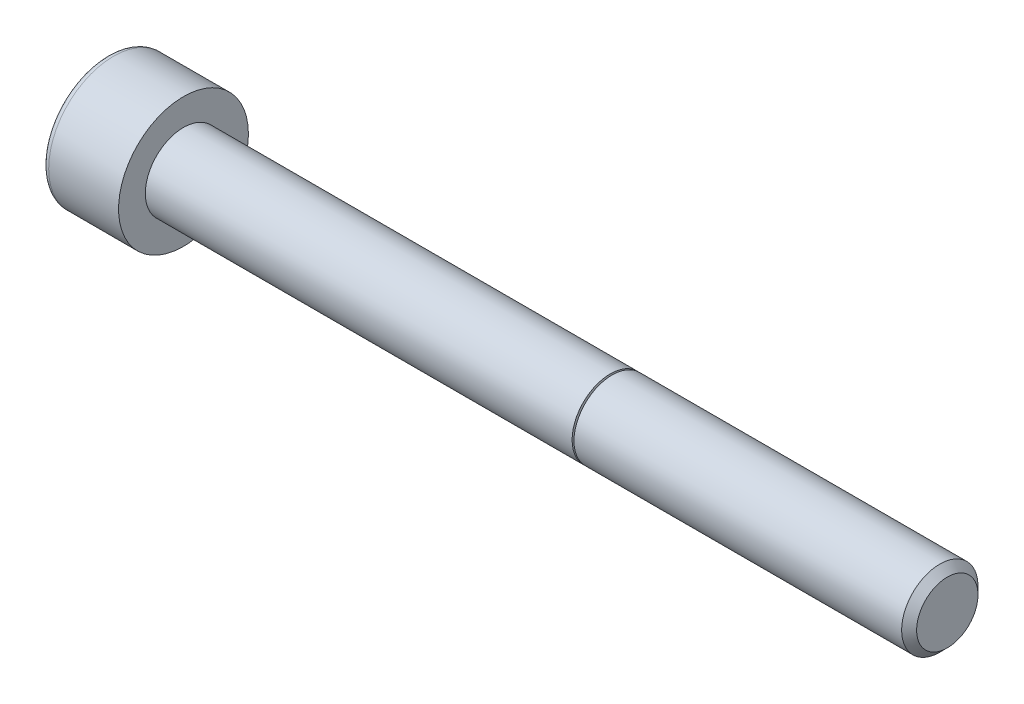
ISO-10303-21;
HEADER;
FILE_DESCRIPTION(('STEP AP214'),'2;1');
FILE_NAME('part.step','',(''),(''),'','','');
FILE_SCHEMA(('AUTOMOTIVE_DESIGN { 1 0 10303 214 1 1 1 1 }'));
ENDSEC;
DATA;
#1=APPLICATION_CONTEXT('core data for automotive mechanical design processes');
#2=APPLICATION_PROTOCOL_DEFINITION('international standard','automotive_design',2000,#1);
#3=PRODUCT_CONTEXT('',#1,'mechanical');
#4=PRODUCT('Part','Part','',(#3));
#5=PRODUCT_RELATED_PRODUCT_CATEGORY('part','',(#4));
#6=PRODUCT_DEFINITION_FORMATION('','',#4);
#7=PRODUCT_DEFINITION_CONTEXT('part definition',#1,'design');
#8=PRODUCT_DEFINITION('design','',#6,#7);
#9=PRODUCT_DEFINITION_SHAPE('','',#8);
#10=(LENGTH_UNIT() NAMED_UNIT(*) SI_UNIT(.MILLI.,.METRE.));
#11=(NAMED_UNIT(*) PLANE_ANGLE_UNIT() SI_UNIT($,.RADIAN.));
#12=(NAMED_UNIT(*) SI_UNIT($,.STERADIAN.) SOLID_ANGLE_UNIT());
#13=UNCERTAINTY_MEASURE_WITH_UNIT(LENGTH_MEASURE(1.E-05),#10,'distance_accuracy_value','');
#14=(GEOMETRIC_REPRESENTATION_CONTEXT(3) GLOBAL_UNCERTAINTY_ASSIGNED_CONTEXT((#13)) GLOBAL_UNIT_ASSIGNED_CONTEXT((#10,
#11,#12)) REPRESENTATION_CONTEXT('',''));
#15=CARTESIAN_POINT('',(0.,0.,0.));
#16=DIRECTION('',(0.,0.,1.));
#17=DIRECTION('',(1.,0.,0.));
#18=AXIS2_PLACEMENT_3D('',#15,#16,#17);
#19=CARTESIAN_POINT('',(50.,-2.04969,2.0095));
#20=DIRECTION('',(1.,0.,0.));
#21=DIRECTION('',(0.,0.,-1.));
#22=AXIS2_PLACEMENT_3D('',#19,#20,#21);
#23=PLANE('',#22);
#24=CARTESIAN_POINT('',(50.,0.,0.));
#25=DIRECTION('',(-1.,0.,0.));
#26=DIRECTION('',(0.,0.,1.));
#27=AXIS2_PLACEMENT_3D('',#24,#25,#26);
#28=CIRCLE('',#27,2.00950000000001);
#29=CARTESIAN_POINT('',(50.,0.,2.00950000000001));
#30=VERTEX_POINT('',#29);
#31=EDGE_CURVE('E20',#30,#30,#28,.T.);
#32=ORIENTED_EDGE('',*,*,#31,.F.);
#33=EDGE_LOOP('',(#32));
#34=FACE_BOUND('',#33,.T.);
#35=ADVANCED_FACE('F16',(#34),#23,.T.);
#36=CARTESIAN_POINT('',(50.,0.,0.));
#37=DIRECTION('',(-1.,0.,0.));
#38=DIRECTION('',(0.,0.,1.));
#39=AXIS2_PLACEMENT_3D('',#36,#37,#38);
#40=CONICAL_SURFACE('',#39,2.0095,0.785398163397452);
#41=ORIENTED_EDGE('',*,*,#31,.T.);
#42=EDGE_LOOP('',(#41));
#43=FACE_BOUND('',#42,.T.);
#44=CARTESIAN_POINT('',(49.5095,0.,0.));
#45=DIRECTION('',(-1.,0.,0.));
#46=DIRECTION('',(0.,-1.,0.));
#47=AXIS2_PLACEMENT_3D('',#44,#45,#46);
#48=CIRCLE('',#47,2.5);
#49=CARTESIAN_POINT('',(49.5095,-2.49999999999999,0.));
#50=VERTEX_POINT('',#49);
#51=EDGE_CURVE('E122',#50,#50,#48,.T.);
#52=ORIENTED_EDGE('',*,*,#51,.F.);
#53=EDGE_LOOP('',(#52));
#54=FACE_BOUND('',#53,.T.);
#55=ADVANCED_FACE('F235',(#43,#54),#40,.T.);
#56=CARTESIAN_POINT('',(49.5095,0.,0.));
#57=DIRECTION('',(-1.,0.,0.));
#58=DIRECTION('',(0.,-1.,0.));
#59=AXIS2_PLACEMENT_3D('',#56,#57,#58);
#60=CYLINDRICAL_SURFACE('',#59,2.5);
#61=CARTESIAN_POINT('',(28.0613125,0.,0.));
#62=DIRECTION('',(-1.,0.,0.));
#63=DIRECTION('',(0.,0.,1.));
#64=AXIS2_PLACEMENT_3D('',#61,#62,#63);
#65=CIRCLE('',#64,2.5000000000001);
#66=CARTESIAN_POINT('',(28.0613125,0.,2.5000000000001));
#67=VERTEX_POINT('',#66);
#68=EDGE_CURVE('E119',#67,#67,#65,.T.);
#69=ORIENTED_EDGE('',*,*,#68,.F.);
#70=EDGE_LOOP('',(#69));
#71=FACE_BOUND('',#70,.T.);
#72=ORIENTED_EDGE('',*,*,#51,.T.);
#73=EDGE_LOOP('',(#72));
#74=FACE_BOUND('',#73,.T.);
#75=ADVANCED_FACE('F229',(#71,#74),#60,.T.);
#76=CARTESIAN_POINT('',(28.,0.,0.));
#77=DIRECTION('',(1.,0.,0.));
#78=DIRECTION('',(0.,0.,-1.));
#79=AXIS2_PLACEMENT_3D('',#76,#77,#78);
#80=CONICAL_SURFACE('',#79,2.0095,1.44644133224817);
#81=CARTESIAN_POINT('',(28.,0.,0.));
#82=DIRECTION('',(-1.,0.,0.));
#83=DIRECTION('',(0.,0.,1.));
#84=AXIS2_PLACEMENT_3D('',#81,#82,#83);
#85=CIRCLE('',#84,2.0095);
#86=CARTESIAN_POINT('',(28.,0.,2.0095));
#87=VERTEX_POINT('',#86);
#88=EDGE_CURVE('E116',#87,#87,#85,.T.);
#89=ORIENTED_EDGE('',*,*,#88,.F.);
#90=EDGE_LOOP('',(#89));
#91=FACE_BOUND('',#90,.T.);
#92=ORIENTED_EDGE('',*,*,#68,.T.);
#93=EDGE_LOOP('',(#92));
#94=FACE_BOUND('',#93,.T.);
#95=ADVANCED_FACE('F223',(#91,#94),#80,.T.);
#96=CARTESIAN_POINT('',(27.9386875,0.,0.));
#97=DIRECTION('',(-1.,0.,0.));
#98=DIRECTION('',(0.,0.,1.));
#99=AXIS2_PLACEMENT_3D('',#96,#97,#98);
#100=CONICAL_SURFACE('',#99,2.5,1.44644133224813);
#101=CARTESIAN_POINT('',(27.9386875,0.,0.));
#102=DIRECTION('',(-1.,0.,0.));
#103=DIRECTION('',(0.,0.,1.));
#104=AXIS2_PLACEMENT_3D('',#101,#102,#103);
#105=CIRCLE('',#104,2.5);
#106=CARTESIAN_POINT('',(27.9386875,0.,2.50000000000001));
#107=VERTEX_POINT('',#106);
#108=EDGE_CURVE('E113',#107,#107,#105,.T.);
#109=ORIENTED_EDGE('',*,*,#108,.F.);
#110=EDGE_LOOP('',(#109));
#111=FACE_BOUND('',#110,.T.);
#112=ORIENTED_EDGE('',*,*,#88,.T.);
#113=EDGE_LOOP('',(#112));
#114=FACE_BOUND('',#113,.T.);
#115=ADVANCED_FACE('F218',(#111,#114),#100,.T.);
#116=CARTESIAN_POINT('',(27.9386875,0.,0.));
#117=DIRECTION('',(-1.,0.,0.));
#118=DIRECTION('',(0.,0.,1.));
#119=AXIS2_PLACEMENT_3D('',#116,#117,#118);
#120=CYLINDRICAL_SURFACE('',#119,2.5);
#121=CARTESIAN_POINT('',(0.,0.,0.));
#122=DIRECTION('',(-1.,0.,0.));
#123=DIRECTION('',(0.,0.,1.));
#124=AXIS2_PLACEMENT_3D('',#121,#122,#123);
#125=CIRCLE('',#124,2.5);
#126=CARTESIAN_POINT('',(0.,0.,2.50000000000001));
#127=VERTEX_POINT('',#126);
#128=EDGE_CURVE('E92',#127,#127,#125,.T.);
#129=ORIENTED_EDGE('',*,*,#128,.F.);
#130=EDGE_LOOP('',(#129));
#131=FACE_BOUND('',#130,.T.);
#132=ORIENTED_EDGE('',*,*,#108,.T.);
#133=EDGE_LOOP('',(#132));
#134=FACE_BOUND('',#133,.T.);
#135=ADVANCED_FACE('F215',(#131,#134),#120,.T.);
#136=CARTESIAN_POINT('',(-1.9,0.,0.));
#137=DIRECTION('',(-1.,0.,0.));
#138=DIRECTION('',(0.,0.,1.));
#139=AXIS2_PLACEMENT_3D('',#136,#137,#138);
#140=CONICAL_SURFACE('',#139,2.3094010767585,1.0471975511966);
#141=CARTESIAN_POINT('',(-1.9,0.,2.3094010767585));
#142=CARTESIAN_POINT('',(-1.87069554512665,-0.0878878875630438,2.25865898121547));
#143=CARTESIAN_POINT('',(-1.84404467710022,-0.176534422121215,2.20747888062559));
#144=CARTESIAN_POINT('',(-1.79752638740027,-0.355362346686105,2.10423253023943));
#145=CARTESIAN_POINT('',(-1.77767542033809,-0.44554691308464,2.05216444655249));
#146=CARTESIAN_POINT('',(-1.74677595894609,-0.624798433758891,1.94867353283856));
#147=CARTESIAN_POINT('',(-1.73552178759691,-0.713837815616439,1.89726662175463));
#148=CARTESIAN_POINT('',(-1.72208916813045,-0.892335320462004,1.79421103928237));
#149=CARTESIAN_POINT('',(-1.7198995939742,-0.981792795105295,1.74256274221605));
#150=CARTESIAN_POINT('',(-1.72446629015479,-1.14893448970974,1.64606343984337));
#151=CARTESIAN_POINT('',(-1.73010128521626,-1.22664379064383,1.60119795403054));
#152=CARTESIAN_POINT('',(-1.74795730071816,-1.38155614176471,1.5117592664101));
#153=CARTESIAN_POINT('',(-1.76018441476867,-1.45875865655097,1.46718637371614));
#154=CARTESIAN_POINT('',(-1.79074983333835,-1.61399014172453,1.37756343396448));
#155=CARTESIAN_POINT('',(-1.80921764221832,-1.69199947538354,1.33252472417715));
#156=CARTESIAN_POINT('',(-1.85113176083937,-1.84685497000488,1.24311886267203));
#157=CARTESIAN_POINT('',(-1.87456822875222,-1.92370311331472,1.19875056644538));
#158=CARTESIAN_POINT('',(-1.90000000000001,-1.99999999999999,1.15470053837931));
#159=B_SPLINE_CURVE_WITH_KNOTS('',3,(#141,#142,#143,#144,#145,#146,#147,#148,#149,#150,#151,
#152,#153,#154,#155,#156,#157,#158),.UNSPECIFIED.,.F.,.F.,(4,2,2,2,2,2,2,2,4),(0.,
0.317016011556855,0.634793817027109,0.944707606152922,1.25424088889782,1.52370778263188,
1.79342419379439,2.06912162248864,2.34427797351492),.UNSPECIFIED.);
#160=CARTESIAN_POINT('',(-1.9,0.,2.3094010767585));
#161=VERTEX_POINT('',#160);
#162=CARTESIAN_POINT('',(-1.90000000000001,-2.,1.1547005383793));
#163=VERTEX_POINT('',#162);
#164=EDGE_CURVE('E82',#161,#163,#159,.T.);
#165=ORIENTED_EDGE('',*,*,#164,.F.);
#166=CARTESIAN_POINT('',(-1.90000000000002,2.,1.1547005383793));
#167=CARTESIAN_POINT('',(-1.87069554512667,1.91211211243696,1.20544263392233));
#168=CARTESIAN_POINT('',(-1.84404467710023,1.82346557787879,1.25662273451221));
#169=CARTESIAN_POINT('',(-1.79752638740028,1.6446376533139,1.35986908489837));
#170=CARTESIAN_POINT('',(-1.7776754203381,1.55445308691536,1.41193716858531));
#171=CARTESIAN_POINT('',(-1.74677595894609,1.37520156624111,1.51542808229924));
#172=CARTESIAN_POINT('',(-1.73552178759691,1.28616218438356,1.56683499338317));
#173=CARTESIAN_POINT('',(-1.72208916813045,1.10766467953799,1.66989057585543));
#174=CARTESIAN_POINT('',(-1.7198995939742,1.0182072048947,1.72153887292176));
#175=CARTESIAN_POINT('',(-1.72446629015479,0.851065510290257,1.81803817529444));
#176=CARTESIAN_POINT('',(-1.73010128521625,0.773356209356166,1.86290366110727));
#177=CARTESIAN_POINT('',(-1.74795730071815,0.618443858235278,1.95234234872771));
#178=CARTESIAN_POINT('',(-1.76018441476867,0.541241343449025,1.99691524142166));
#179=CARTESIAN_POINT('',(-1.79074983333834,0.386009858275461,2.08653818117332));
#180=CARTESIAN_POINT('',(-1.80921764221831,0.308000524616451,2.13157689096065));
#181=CARTESIAN_POINT('',(-1.85113176083936,0.153145029995107,2.22098275246578));
#182=CARTESIAN_POINT('',(-1.87456822875221,0.0762968866852722,2.26535104869243));
#183=CARTESIAN_POINT('',(-1.9,0.,2.3094010767585));
#184=B_SPLINE_CURVE_WITH_KNOTS('',3,(#166,#167,#168,#169,#170,#171,#172,#173,#174,#175,#176,
#177,#178,#179,#180,#181,#182,#183),.UNSPECIFIED.,.F.,.F.,(4,2,2,2,2,2,2,2,4),(0.,
0.317016011556859,0.634793817027117,0.944707606152934,1.25424088889784,1.5237077826319,
1.7934241937944,2.06912162248865,2.34427797351493),.UNSPECIFIED.);
#185=CARTESIAN_POINT('',(-1.90000000000001,2.,1.15470053837929));
#186=VERTEX_POINT('',#185);
#187=EDGE_CURVE('E79',#186,#161,#184,.T.);
#188=ORIENTED_EDGE('',*,*,#187,.F.);
#189=CARTESIAN_POINT('',(-1.9,2.,-1.15470053837923));
#190=CARTESIAN_POINT('',(-1.87069554512665,2.,-1.05321634729317));
#191=CARTESIAN_POINT('',(-1.84404467710021,2.,-0.950856146113392));
#192=CARTESIAN_POINT('',(-1.79752638740026,2.,-0.744363445341073));
#193=CARTESIAN_POINT('',(-1.77767542033809,2.,-0.640227277967187));
#194=CARTESIAN_POINT('',(-1.74677595894608,2.,-0.433245450539333));
#195=CARTESIAN_POINT('',(-1.7355217875969,2.,-0.330431628371469));
#196=CARTESIAN_POINT('',(-1.72208916813044,2.,-0.124320463426946));
#197=CARTESIAN_POINT('',(-1.71989959397419,2.,-0.0210238692942912));
#198=CARTESIAN_POINT('',(-1.72446629015478,2.,0.171974735451078));
#199=CARTESIAN_POINT('',(-1.73010128521625,2.,0.261705707076751));
#200=CARTESIAN_POINT('',(-1.74795730071815,2.,0.44058308231764));
#201=CARTESIAN_POINT('',(-1.76018441476866,2.,0.529728867705562));
#202=CARTESIAN_POINT('',(-1.79074983333834,2.,0.708974747208891));
#203=CARTESIAN_POINT('',(-1.80921764221831,2.,0.799052166783559));
#204=CARTESIAN_POINT('',(-1.85113176083936,2.,0.977863889793815));
#205=CARTESIAN_POINT('',(-1.87456822875222,2.,1.06660048224713));
#206=CARTESIAN_POINT('',(-1.90000000000001,2.,1.15470053837928));
#207=B_SPLINE_CURVE_WITH_KNOTS('',3,(#189,#190,#191,#192,#193,#194,#195,#196,#197,#198,#199,
#200,#201,#202,#203,#204,#205,#206),.UNSPECIFIED.,.F.,.F.,(4,2,2,2,2,2,2,2,4),(0.,
0.317016011556853,0.634793817027106,0.944707606152917,1.25424088889781,1.52370778263189,
1.7934241937944,2.06912162248866,2.34427797351496),.UNSPECIFIED.);
#208=CARTESIAN_POINT('',(-1.89999999999999,2.,-1.15470053837921));
#209=VERTEX_POINT('',#208);
#210=EDGE_CURVE('E67',#209,#186,#207,.T.);
#211=ORIENTED_EDGE('',*,*,#210,.F.);
#212=CARTESIAN_POINT('',(-1.9,0.,-2.3094010767585));
#213=CARTESIAN_POINT('',(-1.87069554512665,0.0878878875630413,-2.25865898121547));
#214=CARTESIAN_POINT('',(-1.84404467710021,0.17653442212121,-2.20747888062558));
#215=CARTESIAN_POINT('',(-1.79752638740026,0.355362346686095,-2.10423253023942));
#216=CARTESIAN_POINT('',(-1.77767542033808,0.445546913084628,-2.05216444655247));
#217=CARTESIAN_POINT('',(-1.74677595894607,0.624798433758874,-1.94867353283854));
#218=CARTESIAN_POINT('',(-1.73552178759689,0.71383781561642,-1.89726662175461));
#219=CARTESIAN_POINT('',(-1.72208916813043,0.89233532046198,-1.79421103928234));
#220=CARTESIAN_POINT('',(-1.71989959397418,0.981792795105269,-1.74256274221601));
#221=CARTESIAN_POINT('',(-1.72446629015476,1.14893448970971,-1.64606343984333));
#222=CARTESIAN_POINT('',(-1.73010128521623,1.2266437906438,-1.60119795403049));
#223=CARTESIAN_POINT('',(-1.74795730071813,1.3815561417647,-1.51175926641004));
#224=CARTESIAN_POINT('',(-1.76018441476864,1.45875865655095,-1.46718637371607));
#225=CARTESIAN_POINT('',(-1.79074983333831,1.61399014172452,-1.37756343396441));
#226=CARTESIAN_POINT('',(-1.80921764221829,1.69199947538354,-1.33252472417707));
#227=CARTESIAN_POINT('',(-1.85113176083934,1.84685497000489,-1.24311886267194));
#228=CARTESIAN_POINT('',(-1.87456822875219,1.92370311331472,-1.19875056644528));
#229=CARTESIAN_POINT('',(-1.89999999999999,2.,-1.1547005383792));
#230=B_SPLINE_CURVE_WITH_KNOTS('',3,(#212,#213,#214,#215,#216,#217,#218,#219,#220,#221,#222,
#223,#224,#225,#226,#227,#228,#229),.UNSPECIFIED.,.F.,.F.,(4,2,2,2,2,2,2,2,4),(0.,
0.317016011556855,0.634793817027109,0.944707606152921,1.25424088889782,1.5237077826319,
1.79342419379442,2.06912162248868,2.34427797351498),.UNSPECIFIED.);
#231=CARTESIAN_POINT('',(-1.9,0.,-2.3094010767585));
#232=VERTEX_POINT('',#231);
#233=EDGE_CURVE('E134',#232,#209,#230,.T.);
#234=ORIENTED_EDGE('',*,*,#233,.F.);
#235=CARTESIAN_POINT('',(-1.90000000000001,-1.99999999999999,-1.1547005383793));
#236=CARTESIAN_POINT('',(-1.87069554512666,-1.91211211243695,-1.20544263392233));
#237=CARTESIAN_POINT('',(-1.84404467710023,-1.82346557787878,-1.25662273451222));
#238=CARTESIAN_POINT('',(-1.79752638740027,-1.64463765331388,-1.35986908489838));
#239=CARTESIAN_POINT('',(-1.7776754203381,-1.55445308691535,-1.41193716858532));
#240=CARTESIAN_POINT('',(-1.74677595894609,-1.3752015662411,-1.51542808229924));
#241=CARTESIAN_POINT('',(-1.73552178759691,-1.28616218438355,-1.56683499338317));
#242=CARTESIAN_POINT('',(-1.72208916813045,-1.10766467953798,-1.66989057585543));
#243=CARTESIAN_POINT('',(-1.7198995939742,-1.01820720489469,-1.72153887292176));
#244=CARTESIAN_POINT('',(-1.72446629015479,-0.851065510290249,-1.81803817529444));
#245=CARTESIAN_POINT('',(-1.73010128521626,-0.773356209356158,-1.86290366110727));
#246=CARTESIAN_POINT('',(-1.74795730071816,-0.618443858235273,-1.95234234872771));
#247=CARTESIAN_POINT('',(-1.76018441476867,-0.541241343449019,-1.99691524142167));
#248=CARTESIAN_POINT('',(-1.79074983333834,-0.386009858275457,-2.08653818117332));
#249=CARTESIAN_POINT('',(-1.80921764221831,-0.308000524616448,-2.13157689096065));
#250=CARTESIAN_POINT('',(-1.85113176083936,-0.153145029995106,-2.22098275246578));
#251=CARTESIAN_POINT('',(-1.87456822875221,-0.0762968866852709,-2.26535104869243));
#252=CARTESIAN_POINT('',(-1.9,0.,-2.3094010767585));
#253=B_SPLINE_CURVE_WITH_KNOTS('',3,(#235,#236,#237,#238,#239,#240,#241,#242,#243,#244,#245,
#246,#247,#248,#249,#250,#251,#252),.UNSPECIFIED.,.F.,.F.,(4,2,2,2,2,2,2,2,4),(0.,
0.317016011556858,0.634793817027115,0.944707606152931,1.25424088889783,1.52370778263189,
1.79342419379439,2.06912162248864,2.34427797351492),.UNSPECIFIED.);
#254=CARTESIAN_POINT('',(-1.90000000000001,-2.,-1.1547005383793));
#255=VERTEX_POINT('',#254);
#256=EDGE_CURVE('E142',#255,#232,#253,.T.);
#257=ORIENTED_EDGE('',*,*,#256,.F.);
#258=CARTESIAN_POINT('',(-1.90000000000001,-2.,1.15470053837929));
#259=CARTESIAN_POINT('',(-1.87069554512666,-2.,1.05321634729323));
#260=CARTESIAN_POINT('',(-1.84404467710023,-2.,0.950856146113455));
#261=CARTESIAN_POINT('',(-1.79752638740027,-2.,0.744363445341134));
#262=CARTESIAN_POINT('',(-1.7776754203381,-2.,0.640227277967246));
#263=CARTESIAN_POINT('',(-1.74677595894609,-2.,0.43324545053939));
#264=CARTESIAN_POINT('',(-1.73552178759691,-2.,0.330431628371524));
#265=CARTESIAN_POINT('',(-1.72208916813044,-2.,0.124320463426999));
#266=CARTESIAN_POINT('',(-1.71989959397419,-2.,0.0210238692943427));
#267=CARTESIAN_POINT('',(-1.72446629015478,-2.,-0.171974735451032));
#268=CARTESIAN_POINT('',(-1.73010128521624,-2.,-0.261705707076711));
#269=CARTESIAN_POINT('',(-1.74795730071814,-2.,-0.440583082317611));
#270=CARTESIAN_POINT('',(-1.76018441476866,-2.,-0.529728867705538));
#271=CARTESIAN_POINT('',(-1.79074983333833,-2.,-0.708974747208878));
#272=CARTESIAN_POINT('',(-1.80921764221831,-2.,-0.799052166783552));
#273=CARTESIAN_POINT('',(-1.85113176083936,-2.,-0.977863889793819));
#274=CARTESIAN_POINT('',(-1.87456822875222,-2.,-1.06660048224714));
#275=CARTESIAN_POINT('',(-1.90000000000001,-2.,-1.15470053837929));
#276=B_SPLINE_CURVE_WITH_KNOTS('',3,(#258,#259,#260,#261,#262,#263,#264,#265,#266,#267,#268,
#269,#270,#271,#272,#273,#274,#275),.UNSPECIFIED.,.F.,.F.,(4,2,2,2,2,2,2,2,4),(0.,
0.317016011556858,0.634793817027115,0.944707606152931,1.25424088889783,1.52370778263192,
1.79342419379445,2.06912162248873,2.34427797351504),.UNSPECIFIED.);
#277=EDGE_CURVE('E184',#163,#255,#276,.T.);
#278=ORIENTED_EDGE('',*,*,#277,.F.);
#279=EDGE_LOOP('',(#165,#188,#211,#234,#257,#278));
#280=FACE_BOUND('',#279,.T.);
#281=CARTESIAN_POINT('',(-0.56666666666667,0.,0.));
#282=VERTEX_POINT('',#281);
#283=VERTEX_LOOP('',#282);
#284=FACE_BOUND('',#283,.T.);
#285=ADVANCED_FACE('F80',(#280,#284),#140,.F.);
#286=CARTESIAN_POINT('',(0.,-4.335,4.25));
#287=DIRECTION('',(1.,0.,0.));
#288=DIRECTION('',(0.,0.,-1.));
#289=AXIS2_PLACEMENT_3D('',#286,#287,#288);
#290=PLANE('',#289);
#291=CARTESIAN_POINT('',(0.,0.,0.));
#292=DIRECTION('',(1.,0.,0.));
#293=DIRECTION('',(0.,0.,-1.));
#294=AXIS2_PLACEMENT_3D('',#291,#292,#293);
#295=CIRCLE('',#294,4.25);
#296=CARTESIAN_POINT('',(0.,0.,-4.25));
#297=VERTEX_POINT('',#296);
#298=EDGE_CURVE('E107',#297,#297,#295,.F.);
#299=ORIENTED_EDGE('',*,*,#298,.F.);
#300=EDGE_LOOP('',(#299));
#301=FACE_BOUND('',#300,.T.);
#302=ORIENTED_EDGE('',*,*,#128,.T.);
#303=EDGE_LOOP('',(#302));
#304=FACE_BOUND('',#303,.T.);
#305=ADVANCED_FACE('F213',(#301,#304),#290,.T.);
#306=CARTESIAN_POINT('',(-5.,2.,-1.1547005383793));
#307=DIRECTION('',(0.,-1.,0.));
#308=DIRECTION('',(1.,0.,0.));
#309=AXIS2_PLACEMENT_3D('',#306,#307,#308);
#310=PLANE('',#309);
#311=DIRECTION('',(0.,0.,1.));
#312=VECTOR('',#311,1.);
#313=CARTESIAN_POINT('',(-4.99999999995,2.,0.));
#314=LINE('',#313,#312);
#315=CARTESIAN_POINT('',(-4.99999999995,2.,-1.15470053837925));
#316=VERTEX_POINT('',#315);
#317=CARTESIAN_POINT('',(-4.99999999995,2.,1.1547005383793));
#318=VERTEX_POINT('',#317);
#319=EDGE_CURVE('E72',#316,#318,#314,.T.);
#320=ORIENTED_EDGE('',*,*,#319,.F.);
#321=DIRECTION('',(-1.,0.,0.));
#322=VECTOR('',#321,1.);
#323=CARTESIAN_POINT('',(-3.28333333333335,2.,-1.1547005383792));
#324=LINE('',#323,#322);
#325=EDGE_CURVE('E90',#209,#316,#324,.T.);
#326=ORIENTED_EDGE('',*,*,#325,.F.);
#327=ORIENTED_EDGE('',*,*,#210,.T.);
#328=DIRECTION('',(1.,0.,0.));
#329=VECTOR('',#328,1.);
#330=CARTESIAN_POINT('',(-3.28333333333335,2.,1.1547005383793));
#331=LINE('',#330,#329);
#332=EDGE_CURVE('E86',#318,#186,#331,.T.);
#333=ORIENTED_EDGE('',*,*,#332,.F.);
#334=EDGE_LOOP('',(#320,#326,#327,#333));
#335=FACE_BOUND('',#334,.T.);
#336=ADVANCED_FACE('F88',(#335),#310,.T.);
#337=CARTESIAN_POINT('',(-5.,2.,1.1547005383793));
#338=DIRECTION('',(0.,-0.499999999999983,-0.866025403784448));
#339=DIRECTION('',(1.,0.,0.));
#340=AXIS2_PLACEMENT_3D('',#337,#338,#339);
#341=PLANE('',#340);
#342=DIRECTION('',(0.,-0.866025403784448,0.499999999999983));
#343=VECTOR('',#342,1.);
#344=CARTESIAN_POINT('',(-4.99999999995,2.,1.1547005383793));
#345=LINE('',#344,#343);
#346=CARTESIAN_POINT('',(-4.99999999995,0.,2.3094010767585));
#347=VERTEX_POINT('',#346);
#348=EDGE_CURVE('E96',#318,#347,#345,.T.);
#349=ORIENTED_EDGE('',*,*,#348,.F.);
#350=ORIENTED_EDGE('',*,*,#332,.T.);
#351=ORIENTED_EDGE('',*,*,#187,.T.);
#352=DIRECTION('',(1.,0.,0.));
#353=VECTOR('',#352,1.);
#354=CARTESIAN_POINT('',(-3.28333333333335,0.,2.3094010767585));
#355=LINE('',#354,#353);
#356=EDGE_CURVE('E98',#347,#161,#355,.T.);
#357=ORIENTED_EDGE('',*,*,#356,.F.);
#358=EDGE_LOOP('',(#349,#350,#351,#357));
#359=FACE_BOUND('',#358,.T.);
#360=ADVANCED_FACE('F94',(#359),#341,.T.);
#361=CARTESIAN_POINT('',(-5.,0.,2.3094010767585));
#362=DIRECTION('',(0.,0.499999999999983,-0.866025403784448));
#363=DIRECTION('',(1.,0.,0.));
#364=AXIS2_PLACEMENT_3D('',#361,#362,#363);
#365=PLANE('',#364);
#366=DIRECTION('',(0.,-0.866025403784448,-0.499999999999983));
#367=VECTOR('',#366,1.);
#368=CARTESIAN_POINT('',(-4.99999999995,0.,2.3094010767585));
#369=LINE('',#368,#367);
#370=CARTESIAN_POINT('',(-4.99999999995,-2.,1.1547005383793));
#371=VERTEX_POINT('',#370);
#372=EDGE_CURVE('E112',#347,#371,#369,.T.);
#373=ORIENTED_EDGE('',*,*,#372,.F.);
#374=ORIENTED_EDGE('',*,*,#356,.T.);
#375=ORIENTED_EDGE('',*,*,#164,.T.);
#376=DIRECTION('',(1.,0.,0.));
#377=VECTOR('',#376,1.);
#378=CARTESIAN_POINT('',(-3.28333333333335,-2.,1.1547005383793));
#379=LINE('',#378,#377);
#380=EDGE_CURVE('E180',#371,#163,#379,.T.);
#381=ORIENTED_EDGE('',*,*,#380,.F.);
#382=EDGE_LOOP('',(#373,#374,#375,#381));
#383=FACE_BOUND('',#382,.T.);
#384=ADVANCED_FACE('F195',(#383),#365,.T.);
#385=CARTESIAN_POINT('',(-5.,-2.,1.1547005383793));
#386=DIRECTION('',(0.,1.,0.));
#387=DIRECTION('',(1.,0.,0.));
#388=AXIS2_PLACEMENT_3D('',#385,#386,#387);
#389=PLANE('',#388);
#390=DIRECTION('',(0.,0.,-1.));
#391=VECTOR('',#390,1.);
#392=CARTESIAN_POINT('',(-4.99999999995,-2.,0.));
#393=LINE('',#392,#391);
#394=CARTESIAN_POINT('',(-4.99999999995,-2.,-1.1547005383793));
#395=VERTEX_POINT('',#394);
#396=EDGE_CURVE('E108',#371,#395,#393,.T.);
#397=ORIENTED_EDGE('',*,*,#396,.F.);
#398=ORIENTED_EDGE('',*,*,#380,.T.);
#399=ORIENTED_EDGE('',*,*,#277,.T.);
#400=DIRECTION('',(1.,0.,0.));
#401=VECTOR('',#400,1.);
#402=CARTESIAN_POINT('',(-3.28333333333335,-2.,-1.1547005383793));
#403=LINE('',#402,#401);
#404=EDGE_CURVE('E141',#395,#255,#403,.T.);
#405=ORIENTED_EDGE('',*,*,#404,.F.);
#406=EDGE_LOOP('',(#397,#398,#399,#405));
#407=FACE_BOUND('',#406,.T.);
#408=ADVANCED_FACE('F192',(#407),#389,.T.);
#409=CARTESIAN_POINT('',(-5.,-2.,-1.1547005383793));
#410=DIRECTION('',(0.,0.499999999999983,0.866025403784448));
#411=DIRECTION('',(1.,0.,0.));
#412=AXIS2_PLACEMENT_3D('',#409,#410,#411);
#413=PLANE('',#412);
#414=DIRECTION('',(0.,0.866025403784448,-0.499999999999983));
#415=VECTOR('',#414,1.);
#416=CARTESIAN_POINT('',(-4.99999999995,-2.,-1.1547005383793));
#417=LINE('',#416,#415);
#418=CARTESIAN_POINT('',(-4.99999999995,0.,-2.3094010767585));
#419=VERTEX_POINT('',#418);
#420=EDGE_CURVE('E111',#395,#419,#417,.T.);
#421=ORIENTED_EDGE('',*,*,#420,.F.);
#422=ORIENTED_EDGE('',*,*,#404,.T.);
#423=ORIENTED_EDGE('',*,*,#256,.T.);
#424=DIRECTION('',(1.,0.,0.));
#425=VECTOR('',#424,1.);
#426=CARTESIAN_POINT('',(-3.28333333333335,0.,-2.3094010767585));
#427=LINE('',#426,#425);
#428=EDGE_CURVE('E35',#419,#232,#427,.T.);
#429=ORIENTED_EDGE('',*,*,#428,.F.);
#430=EDGE_LOOP('',(#421,#422,#423,#429));
#431=FACE_BOUND('',#430,.T.);
#432=ADVANCED_FACE('F156',(#431),#413,.T.);
#433=CARTESIAN_POINT('',(-5.,0.,-2.3094010767585));
#434=DIRECTION('',(0.,-0.500000000000015,0.86602540378443));
#435=DIRECTION('',(1.,0.,0.));
#436=AXIS2_PLACEMENT_3D('',#433,#434,#435);
#437=PLANE('',#436);
#438=DIRECTION('',(0.,0.866025403784448,0.499999999999983));
#439=VECTOR('',#438,1.);
#440=CARTESIAN_POINT('',(-4.99999999995,0.,-2.3094010767585));
#441=LINE('',#440,#439);
#442=EDGE_CURVE('E105',#419,#316,#441,.T.);
#443=ORIENTED_EDGE('',*,*,#442,.F.);
#444=ORIENTED_EDGE('',*,*,#428,.T.);
#445=ORIENTED_EDGE('',*,*,#233,.T.);
#446=ORIENTED_EDGE('',*,*,#325,.T.);
#447=EDGE_LOOP('',(#443,#444,#445,#446));
#448=FACE_BOUND('',#447,.T.);
#449=ADVANCED_FACE('F151',(#448),#437,.T.);
#450=CARTESIAN_POINT('',(-4.575,0.,0.));
#451=DIRECTION('',(1.,0.,0.));
#452=DIRECTION('',(0.,0.,-1.));
#453=AXIS2_PLACEMENT_3D('',#450,#451,#452);
#454=CYLINDRICAL_SURFACE('',#453,4.25);
#455=ORIENTED_EDGE('',*,*,#298,.T.);
#456=EDGE_LOOP('',(#455));
#457=FACE_BOUND('',#456,.T.);
#458=CARTESIAN_POINT('',(-4.575,0.,0.));
#459=DIRECTION('',(-1.,0.,0.));
#460=DIRECTION('',(0.,0.,1.));
#461=AXIS2_PLACEMENT_3D('',#458,#459,#460);
#462=CIRCLE('',#461,4.2499999999);
#463=CARTESIAN_POINT('',(-4.575,0.,4.2499999999));
#464=VERTEX_POINT('',#463);
#465=EDGE_CURVE('E26',#464,#464,#462,.T.);
#466=ORIENTED_EDGE('',*,*,#465,.F.);
#467=EDGE_LOOP('',(#466));
#468=FACE_BOUND('',#467,.T.);
#469=ADVANCED_FACE('F155',(#457,#468),#454,.T.);
#470=CARTESIAN_POINT('',(-4.99999999995,-3.9015,-3.825));
#471=DIRECTION('',(-1.,0.,0.));
#472=DIRECTION('',(0.,0.,1.));
#473=AXIS2_PLACEMENT_3D('',#470,#471,#472);
#474=PLANE('',#473);
#475=ORIENTED_EDGE('',*,*,#420,.T.);
#476=ORIENTED_EDGE('',*,*,#442,.T.);
#477=ORIENTED_EDGE('',*,*,#319,.T.);
#478=ORIENTED_EDGE('',*,*,#348,.T.);
#479=ORIENTED_EDGE('',*,*,#372,.T.);
#480=ORIENTED_EDGE('',*,*,#396,.T.);
#481=EDGE_LOOP('',(#475,#476,#477,#478,#479,#480));
#482=FACE_BOUND('',#481,.T.);
#483=CARTESIAN_POINT('',(-4.9999999999,0.,0.));
#484=DIRECTION('',(1.,0.,0.));
#485=DIRECTION('',(0.,0.,-1.));
#486=AXIS2_PLACEMENT_3D('',#483,#484,#485);
#487=CIRCLE('',#486,3.82499999995044);
#488=CARTESIAN_POINT('',(-4.9999999999,0.,-3.82499999995044));
#489=VERTEX_POINT('',#488);
#490=EDGE_CURVE('E10',#489,#489,#487,.T.);
#491=ORIENTED_EDGE('',*,*,#490,.F.);
#492=EDGE_LOOP('',(#491));
#493=FACE_BOUND('',#492,.T.);
#494=ADVANCED_FACE('F161',(#482,#493),#474,.T.);
#495=CARTESIAN_POINT('',(-4.5749999999,0.,0.));
#496=DIRECTION('',(1.,0.,0.));
#497=DIRECTION('',(0.,0.,-1.));
#498=AXIS2_PLACEMENT_3D('',#495,#496,#497);
#499=TOROIDAL_SURFACE('',#498,3.8249999999,0.425000000000002);
#500=ORIENTED_EDGE('',*,*,#490,.T.);
#501=EDGE_LOOP('',(#500));
#502=FACE_BOUND('',#501,.T.);
#503=ORIENTED_EDGE('',*,*,#465,.T.);
#504=EDGE_LOOP('',(#503));
#505=FACE_BOUND('',#504,.T.);
#506=ADVANCED_FACE('F18',(#502,#505),#499,.T.);
#507=CLOSED_SHELL('',(#35,#55,#75,#95,#115,#135,#285,#305,#336,#360,#384,#408,#432,#449,#469,
#494,#506));
#508=MANIFOLD_SOLID_BREP('B1',#507);
#509=ADVANCED_BREP_SHAPE_REPRESENTATION('',(#18,#508),#14);
#510=SHAPE_DEFINITION_REPRESENTATION(#9,#509);
ENDSEC;
END-ISO-10303-21;
